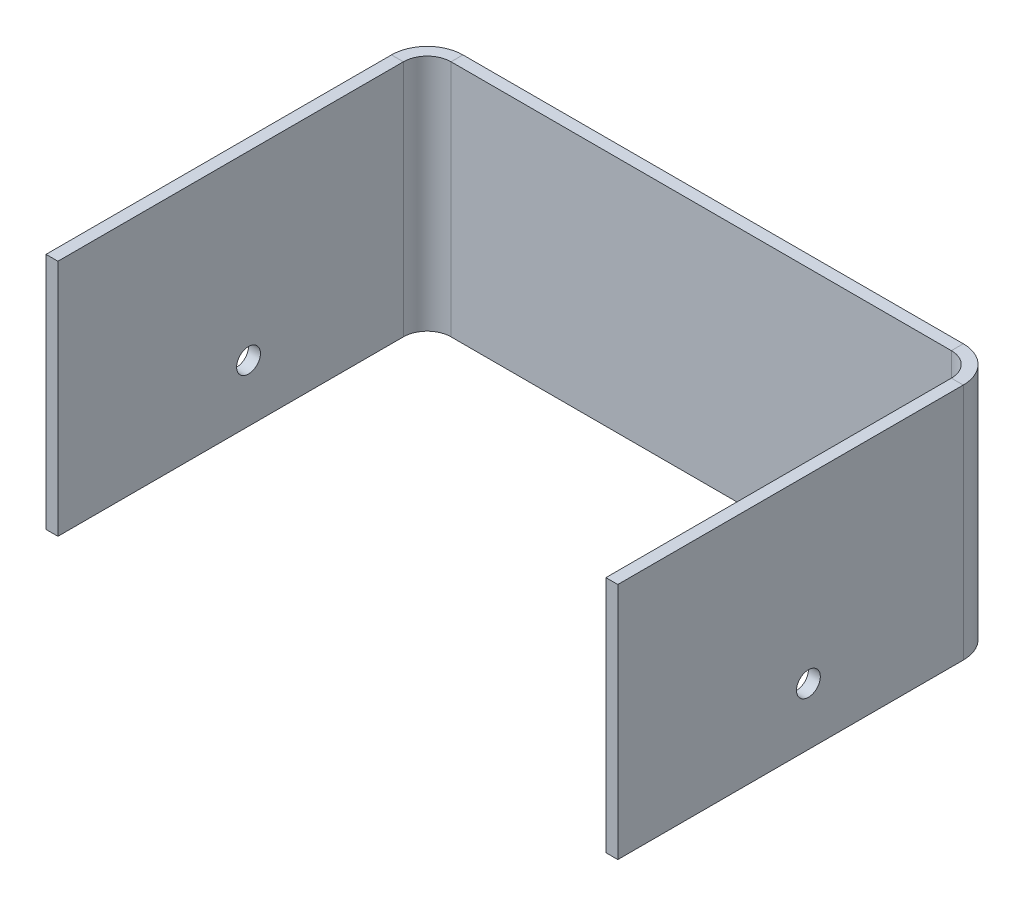
ISO-10303-21;
HEADER;
FILE_DESCRIPTION(('STEP AP214'),'2;1');
FILE_NAME('part.step','',(''),(''),'','','');
FILE_SCHEMA(('AUTOMOTIVE_DESIGN { 1 0 10303 214 1 1 1 1 }'));
ENDSEC;
DATA;
#1=APPLICATION_CONTEXT('core data for automotive mechanical design processes');
#2=APPLICATION_PROTOCOL_DEFINITION('international standard','automotive_design',2000,#1);
#3=PRODUCT_CONTEXT('',#1,'mechanical');
#4=PRODUCT('Part','Part','',(#3));
#5=PRODUCT_RELATED_PRODUCT_CATEGORY('part','',(#4));
#6=PRODUCT_DEFINITION_FORMATION('','',#4);
#7=PRODUCT_DEFINITION_CONTEXT('part definition',#1,'design');
#8=PRODUCT_DEFINITION('design','',#6,#7);
#9=PRODUCT_DEFINITION_SHAPE('','',#8);
#10=(LENGTH_UNIT() NAMED_UNIT(*) SI_UNIT(.MILLI.,.METRE.));
#11=(NAMED_UNIT(*) PLANE_ANGLE_UNIT() SI_UNIT($,.RADIAN.));
#12=(NAMED_UNIT(*) SI_UNIT($,.STERADIAN.) SOLID_ANGLE_UNIT());
#13=UNCERTAINTY_MEASURE_WITH_UNIT(LENGTH_MEASURE(1.E-05),#10,'distance_accuracy_value','');
#14=(GEOMETRIC_REPRESENTATION_CONTEXT(3) GLOBAL_UNCERTAINTY_ASSIGNED_CONTEXT((#13)) GLOBAL_UNIT_ASSIGNED_CONTEXT((#10,
#11,#12)) REPRESENTATION_CONTEXT('',''));
#15=CARTESIAN_POINT('',(0.,0.,0.));
#16=DIRECTION('',(0.,0.,1.));
#17=DIRECTION('',(1.,0.,0.));
#18=AXIS2_PLACEMENT_3D('',#15,#16,#17);
#19=CARTESIAN_POINT('',(0.,0.,3.175));
#20=DIRECTION('',(0.,0.,-1.));
#21=DIRECTION('',(-1.,0.,0.));
#22=AXIS2_PLACEMENT_3D('',#19,#20,#21);
#23=PLANE('',#22);
#24=DIRECTION('',(0.,1.,0.));
#25=VECTOR('',#24,1.);
#26=CARTESIAN_POINT('',(142.875,63.5,3.17500000000001));
#27=LINE('',#26,#25);
#28=CARTESIAN_POINT('',(142.875,63.5,3.17500000000001));
#29=VERTEX_POINT('',#28);
#30=CARTESIAN_POINT('',(142.875,0.,3.17500000000001));
#31=VERTEX_POINT('',#30);
#32=EDGE_CURVE('E245',#29,#31,#27,.F.);
#33=ORIENTED_EDGE('',*,*,#32,.F.);
#34=DIRECTION('',(-1.,0.,0.));
#35=VECTOR('',#34,1.);
#36=CARTESIAN_POINT('',(0.,63.5,3.175));
#37=LINE('',#36,#35);
#38=CARTESIAN_POINT('',(9.52499999999999,63.5,3.175));
#39=VERTEX_POINT('',#38);
#40=EDGE_CURVE('E13',#29,#39,#37,.T.);
#41=ORIENTED_EDGE('',*,*,#40,.T.);
#42=DIRECTION('',(0.,-1.,0.));
#43=VECTOR('',#42,1.);
#44=CARTESIAN_POINT('',(9.52499999999998,0.,3.175));
#45=LINE('',#44,#43);
#46=CARTESIAN_POINT('',(9.52499999999998,0.,3.175));
#47=VERTEX_POINT('',#46);
#48=EDGE_CURVE('E316',#47,#39,#45,.F.);
#49=ORIENTED_EDGE('',*,*,#48,.F.);
#50=DIRECTION('',(1.,0.,0.));
#51=VECTOR('',#50,1.);
#52=CARTESIAN_POINT('',(0.,0.,3.175));
#53=LINE('',#52,#51);
#54=EDGE_CURVE('E95',#47,#31,#53,.T.);
#55=ORIENTED_EDGE('',*,*,#54,.T.);
#56=EDGE_LOOP('',(#33,#41,#49,#55));
#57=FACE_BOUND('',#56,.T.);
#58=ADVANCED_FACE('F85',(#57),#23,.F.);
#59=CARTESIAN_POINT('',(0.,0.,0.));
#60=DIRECTION('',(0.,0.,-1.));
#61=DIRECTION('',(-1.,0.,0.));
#62=AXIS2_PLACEMENT_3D('',#59,#60,#61);
#63=PLANE('',#62);
#64=DIRECTION('',(-1.,0.,0.));
#65=VECTOR('',#64,1.);
#66=CARTESIAN_POINT('',(0.,63.5,0.));
#67=LINE('',#66,#65);
#68=CARTESIAN_POINT('',(142.875,63.5,0.));
#69=VERTEX_POINT('',#68);
#70=CARTESIAN_POINT('',(9.52499999999999,63.5,0.));
#71=VERTEX_POINT('',#70);
#72=EDGE_CURVE('E331',#69,#71,#67,.T.);
#73=ORIENTED_EDGE('',*,*,#72,.F.);
#74=DIRECTION('',(0.,1.,0.));
#75=VECTOR('',#74,1.);
#76=CARTESIAN_POINT('',(142.875,63.5,0.));
#77=LINE('',#76,#75);
#78=CARTESIAN_POINT('',(142.875,0.,0.));
#79=VERTEX_POINT('',#78);
#80=EDGE_CURVE('E230',#69,#79,#77,.F.);
#81=ORIENTED_EDGE('',*,*,#80,.T.);
#82=DIRECTION('',(-1.,0.,0.));
#83=VECTOR('',#82,1.);
#84=CARTESIAN_POINT('',(0.,0.,0.));
#85=LINE('',#84,#83);
#86=CARTESIAN_POINT('',(9.52499999999998,0.,0.));
#87=VERTEX_POINT('',#86);
#88=EDGE_CURVE('E325',#87,#79,#85,.F.);
#89=ORIENTED_EDGE('',*,*,#88,.F.);
#90=DIRECTION('',(0.,-1.,0.));
#91=VECTOR('',#90,1.);
#92=CARTESIAN_POINT('',(9.52499999999998,0.,0.));
#93=LINE('',#92,#91);
#94=EDGE_CURVE('E301',#87,#71,#93,.F.);
#95=ORIENTED_EDGE('',*,*,#94,.T.);
#96=EDGE_LOOP('',(#73,#81,#89,#95));
#97=FACE_BOUND('',#96,.T.);
#98=ADVANCED_FACE('F343',(#97),#63,.T.);
#99=CARTESIAN_POINT('',(0.,63.5,3.175));
#100=DIRECTION('',(0.,-1.,0.));
#101=DIRECTION('',(-1.,0.,0.));
#102=AXIS2_PLACEMENT_3D('',#99,#100,#101);
#103=PLANE('',#102);
#104=ORIENTED_EDGE('',*,*,#40,.F.);
#105=DIRECTION('',(0.,0.,-1.));
#106=VECTOR('',#105,1.);
#107=CARTESIAN_POINT('',(142.875,63.5,3.17500000000001));
#108=LINE('',#107,#106);
#109=EDGE_CURVE('E237',#29,#69,#108,.T.);
#110=ORIENTED_EDGE('',*,*,#109,.T.);
#111=ORIENTED_EDGE('',*,*,#72,.T.);
#112=DIRECTION('',(0.,0.,-1.));
#113=VECTOR('',#112,1.);
#114=CARTESIAN_POINT('',(9.52499999999999,63.5,3.175));
#115=LINE('',#114,#113);
#116=EDGE_CURVE('E322',#39,#71,#115,.T.);
#117=ORIENTED_EDGE('',*,*,#116,.F.);
#118=EDGE_LOOP('',(#104,#110,#111,#117));
#119=FACE_BOUND('',#118,.T.);
#120=ADVANCED_FACE('F351',(#119),#103,.F.);
#121=CARTESIAN_POINT('',(0.,0.,3.175));
#122=DIRECTION('',(0.,1.,0.));
#123=DIRECTION('',(1.,0.,0.));
#124=AXIS2_PLACEMENT_3D('',#121,#122,#123);
#125=PLANE('',#124);
#126=DIRECTION('',(0.,0.,-1.));
#127=VECTOR('',#126,1.);
#128=CARTESIAN_POINT('',(142.875,0.,3.17500000000001));
#129=LINE('',#128,#127);
#130=EDGE_CURVE('E252',#31,#79,#129,.T.);
#131=ORIENTED_EDGE('',*,*,#130,.F.);
#132=ORIENTED_EDGE('',*,*,#54,.F.);
#133=DIRECTION('',(0.,0.,-1.));
#134=VECTOR('',#133,1.);
#135=CARTESIAN_POINT('',(9.52499999999998,0.,3.175));
#136=LINE('',#135,#134);
#137=EDGE_CURVE('E308',#47,#87,#136,.T.);
#138=ORIENTED_EDGE('',*,*,#137,.T.);
#139=ORIENTED_EDGE('',*,*,#88,.T.);
#140=EDGE_LOOP('',(#131,#132,#138,#139));
#141=FACE_BOUND('',#140,.T.);
#142=ADVANCED_FACE('F87',(#141),#125,.F.);
#143=CARTESIAN_POINT('',(9.52499999999998,63.5,9.525));
#144=DIRECTION('',(0.,1.,0.));
#145=DIRECTION('',(-1.,0.,0.));
#146=AXIS2_PLACEMENT_3D('',#143,#144,#145);
#147=PLANE('',#146);
#148=DIRECTION('',(1.,0.,0.));
#149=VECTOR('',#148,1.);
#150=CARTESIAN_POINT('',(0.,63.5,9.52499999999997));
#151=LINE('',#150,#149);
#152=CARTESIAN_POINT('',(3.17499999999998,63.5,9.52499999999998));
#153=VERTEX_POINT('',#152);
#154=CARTESIAN_POINT('',(0.,63.5,9.52499999999997));
#155=VERTEX_POINT('',#154);
#156=EDGE_CURVE('E255',#153,#155,#151,.F.);
#157=ORIENTED_EDGE('',*,*,#156,.F.);
#158=CARTESIAN_POINT('',(9.52499999999998,63.5,9.525));
#159=DIRECTION('',(0.,-1.,0.));
#160=DIRECTION('',(1.,0.,0.));
#161=AXIS2_PLACEMENT_3D('',#158,#159,#160);
#162=CIRCLE('',#161,6.35);
#163=EDGE_CURVE('E312',#39,#153,#162,.F.);
#164=ORIENTED_EDGE('',*,*,#163,.F.);
#165=ORIENTED_EDGE('',*,*,#116,.T.);
#166=CARTESIAN_POINT('',(9.52499999999998,63.5,9.525));
#167=DIRECTION('',(0.,-1.,0.));
#168=DIRECTION('',(1.,0.,0.));
#169=AXIS2_PLACEMENT_3D('',#166,#167,#168);
#170=CIRCLE('',#169,9.525);
#171=EDGE_CURVE('E103',#71,#155,#170,.F.);
#172=ORIENTED_EDGE('',*,*,#171,.T.);
#173=EDGE_LOOP('',(#157,#164,#165,#172));
#174=FACE_BOUND('',#173,.T.);
#175=ADVANCED_FACE('F387',(#174),#147,.T.);
#176=CARTESIAN_POINT('',(9.52499999999997,0.,9.525));
#177=DIRECTION('',(0.,1.,0.));
#178=DIRECTION('',(-1.,0.,0.));
#179=AXIS2_PLACEMENT_3D('',#176,#177,#178);
#180=PLANE('',#179);
#181=CARTESIAN_POINT('',(9.52499999999997,0.,9.525));
#182=DIRECTION('',(0.,-1.,0.));
#183=DIRECTION('',(1.,0.,0.));
#184=AXIS2_PLACEMENT_3D('',#181,#182,#183);
#185=CIRCLE('',#184,6.35);
#186=CARTESIAN_POINT('',(3.17499999999997,0.,9.52499999999998));
#187=VERTEX_POINT('',#186);
#188=EDGE_CURVE('E263',#187,#47,#185,.T.);
#189=ORIENTED_EDGE('',*,*,#188,.F.);
#190=DIRECTION('',(1.,0.,0.));
#191=VECTOR('',#190,1.);
#192=CARTESIAN_POINT('',(3.17499999999998,0.,9.52499999999998));
#193=LINE('',#192,#191);
#194=CARTESIAN_POINT('',(0.,0.,9.52499999999997));
#195=VERTEX_POINT('',#194);
#196=EDGE_CURVE('E291',#187,#195,#193,.F.);
#197=ORIENTED_EDGE('',*,*,#196,.T.);
#198=CARTESIAN_POINT('',(9.52499999999997,0.,9.525));
#199=DIRECTION('',(0.,-1.,0.));
#200=DIRECTION('',(1.,0.,0.));
#201=AXIS2_PLACEMENT_3D('',#198,#199,#200);
#202=CIRCLE('',#201,9.525);
#203=EDGE_CURVE('E305',#195,#87,#202,.T.);
#204=ORIENTED_EDGE('',*,*,#203,.T.);
#205=ORIENTED_EDGE('',*,*,#137,.F.);
#206=EDGE_LOOP('',(#189,#197,#204,#205));
#207=FACE_BOUND('',#206,.T.);
#208=ADVANCED_FACE('F381',(#207),#180,.F.);
#209=CARTESIAN_POINT('',(9.52499999999997,0.,9.525));
#210=DIRECTION('',(0.,-1.,0.));
#211=DIRECTION('',(-1.,0.,0.));
#212=AXIS2_PLACEMENT_3D('',#209,#210,#211);
#213=CYLINDRICAL_SURFACE('',#212,9.525);
#214=ORIENTED_EDGE('',*,*,#94,.F.);
#215=ORIENTED_EDGE('',*,*,#203,.F.);
#216=DIRECTION('',(0.,-1.,0.));
#217=VECTOR('',#216,1.);
#218=CARTESIAN_POINT('',(0.,63.5,9.52499999999997));
#219=LINE('',#218,#217);
#220=EDGE_CURVE('E288',#195,#155,#219,.F.);
#221=ORIENTED_EDGE('',*,*,#220,.T.);
#222=ORIENTED_EDGE('',*,*,#171,.F.);
#223=EDGE_LOOP('',(#214,#215,#221,#222));
#224=FACE_BOUND('',#223,.T.);
#225=ADVANCED_FACE('F395',(#224),#213,.T.);
#226=CARTESIAN_POINT('',(9.52499999999997,0.,9.525));
#227=DIRECTION('',(0.,-1.,0.));
#228=DIRECTION('',(-1.,0.,0.));
#229=AXIS2_PLACEMENT_3D('',#226,#227,#228);
#230=CYLINDRICAL_SURFACE('',#229,6.35);
#231=ORIENTED_EDGE('',*,*,#48,.T.);
#232=ORIENTED_EDGE('',*,*,#163,.T.);
#233=DIRECTION('',(0.,-1.,0.));
#234=VECTOR('',#233,1.);
#235=CARTESIAN_POINT('',(3.17499999999998,63.5,9.52499999999998));
#236=LINE('',#235,#234);
#237=EDGE_CURVE('E295',#153,#187,#236,.T.);
#238=ORIENTED_EDGE('',*,*,#237,.T.);
#239=ORIENTED_EDGE('',*,*,#188,.T.);
#240=EDGE_LOOP('',(#231,#232,#238,#239));
#241=FACE_BOUND('',#240,.T.);
#242=ADVANCED_FACE('F398',(#241),#230,.F.);
#243=CARTESIAN_POINT('',(0.,63.5,3.17499999999999));
#244=DIRECTION('',(0.,-1.,0.));
#245=DIRECTION('',(0.,0.,-1.));
#246=AXIS2_PLACEMENT_3D('',#243,#244,#245);
#247=PLANE('',#246);
#248=ORIENTED_EDGE('',*,*,#156,.T.);
#249=DIRECTION('',(0.,0.,-1.));
#250=VECTOR('',#249,1.);
#251=CARTESIAN_POINT('',(0.,63.5,0.));
#252=LINE('',#251,#250);
#253=CARTESIAN_POINT('',(-3.43458801432613E-13,63.5,101.6));
#254=VERTEX_POINT('',#253);
#255=EDGE_CURVE('E274',#254,#155,#252,.T.);
#256=ORIENTED_EDGE('',*,*,#255,.F.);
#257=DIRECTION('',(1.,0.,0.));
#258=VECTOR('',#257,1.);
#259=CARTESIAN_POINT('',(-3.43649050775635E-13,63.5,101.6));
#260=LINE('',#259,#258);
#261=CARTESIAN_POINT('',(3.17499999999966,63.5,101.6));
#262=VERTEX_POINT('',#261);
#263=EDGE_CURVE('E264',#254,#262,#260,.T.);
#264=ORIENTED_EDGE('',*,*,#263,.T.);
#265=DIRECTION('',(0.,0.,1.));
#266=VECTOR('',#265,1.);
#267=CARTESIAN_POINT('',(3.175,63.5,3.175));
#268=LINE('',#267,#266);
#269=EDGE_CURVE('E284',#262,#153,#268,.F.);
#270=ORIENTED_EDGE('',*,*,#269,.T.);
#271=EDGE_LOOP('',(#248,#256,#264,#270));
#272=FACE_BOUND('',#271,.T.);
#273=ADVANCED_FACE('F401',(#272),#247,.F.);
#274=CARTESIAN_POINT('',(-3.43475248243408E-13,0.,101.6));
#275=DIRECTION('',(0.,1.,0.));
#276=DIRECTION('',(0.,0.,1.));
#277=AXIS2_PLACEMENT_3D('',#274,#275,#276);
#278=PLANE('',#277);
#279=ORIENTED_EDGE('',*,*,#196,.F.);
#280=DIRECTION('',(0.,0.,-1.));
#281=VECTOR('',#280,1.);
#282=CARTESIAN_POINT('',(3.17499999999966,0.,101.6));
#283=LINE('',#282,#281);
#284=CARTESIAN_POINT('',(3.17499999999966,0.,101.6));
#285=VERTEX_POINT('',#284);
#286=EDGE_CURVE('E281',#187,#285,#283,.F.);
#287=ORIENTED_EDGE('',*,*,#286,.T.);
#288=DIRECTION('',(1.,0.,0.));
#289=VECTOR('',#288,1.);
#290=CARTESIAN_POINT('',(-3.43475248243408E-13,0.,101.6));
#291=LINE('',#290,#289);
#292=CARTESIAN_POINT('',(-3.43458801432613E-13,0.,101.6));
#293=VERTEX_POINT('',#292);
#294=EDGE_CURVE('E259',#293,#285,#291,.T.);
#295=ORIENTED_EDGE('',*,*,#294,.F.);
#296=DIRECTION('',(0.,0.,1.));
#297=VECTOR('',#296,1.);
#298=CARTESIAN_POINT('',(0.,0.,0.));
#299=LINE('',#298,#297);
#300=EDGE_CURVE('E271',#195,#293,#299,.T.);
#301=ORIENTED_EDGE('',*,*,#300,.F.);
#302=EDGE_LOOP('',(#279,#287,#295,#301));
#303=FACE_BOUND('',#302,.T.);
#304=ADVANCED_FACE('F407',(#303),#278,.F.);
#305=CARTESIAN_POINT('',(0.,0.,0.));
#306=DIRECTION('',(1.,0.,0.));
#307=DIRECTION('',(0.,0.,-1.));
#308=AXIS2_PLACEMENT_3D('',#305,#306,#307);
#309=PLANE('',#308);
#310=CARTESIAN_POINT('',(-1.66533453693773E-13,15.24,50.8));
#311=DIRECTION('',(1.,0.,0.));
#312=DIRECTION('',(0.,0.,-1.));
#313=AXIS2_PLACEMENT_3D('',#310,#311,#312);
#314=CIRCLE('',#313,3.175);
#315=CARTESIAN_POINT('',(-1.66533453693773E-13,15.24,53.975));
#316=VERTEX_POINT('',#315);
#317=EDGE_CURVE('E229',#316,#316,#314,.T.);
#318=ORIENTED_EDGE('',*,*,#317,.T.);
#319=EDGE_LOOP('',(#318));
#320=FACE_BOUND('',#319,.T.);
#321=ORIENTED_EDGE('',*,*,#220,.F.);
#322=ORIENTED_EDGE('',*,*,#300,.T.);
#323=DIRECTION('',(0.,1.,0.));
#324=VECTOR('',#323,1.);
#325=CARTESIAN_POINT('',(-3.43458801432613E-13,0.,101.6));
#326=LINE('',#325,#324);
#327=EDGE_CURVE('E268',#293,#254,#326,.T.);
#328=ORIENTED_EDGE('',*,*,#327,.T.);
#329=ORIENTED_EDGE('',*,*,#255,.T.);
#330=EDGE_LOOP('',(#321,#322,#328,#329));
#331=FACE_BOUND('',#330,.T.);
#332=ADVANCED_FACE('F410',(#320,#331),#309,.F.);
#333=CARTESIAN_POINT('',(3.17500000000001,0.,0.));
#334=DIRECTION('',(1.,0.,0.));
#335=DIRECTION('',(0.,0.,-1.));
#336=AXIS2_PLACEMENT_3D('',#333,#334,#335);
#337=PLANE('',#336);
#338=CARTESIAN_POINT('',(3.17499999999984,15.24,50.8));
#339=DIRECTION('',(1.,0.,0.));
#340=DIRECTION('',(0.,0.,-1.));
#341=AXIS2_PLACEMENT_3D('',#338,#339,#340);
#342=CIRCLE('',#341,3.175);
#343=CARTESIAN_POINT('',(3.17499999999982,15.24,53.975));
#344=VERTEX_POINT('',#343);
#345=EDGE_CURVE('E439',#344,#344,#342,.T.);
#346=ORIENTED_EDGE('',*,*,#345,.F.);
#347=EDGE_LOOP('',(#346));
#348=FACE_BOUND('',#347,.T.);
#349=ORIENTED_EDGE('',*,*,#286,.F.);
#350=ORIENTED_EDGE('',*,*,#237,.F.);
#351=ORIENTED_EDGE('',*,*,#269,.F.);
#352=DIRECTION('',(0.,-1.,0.));
#353=VECTOR('',#352,1.);
#354=CARTESIAN_POINT('',(3.17499999999966,63.5,101.6));
#355=LINE('',#354,#353);
#356=EDGE_CURVE('E278',#285,#262,#355,.F.);
#357=ORIENTED_EDGE('',*,*,#356,.F.);
#358=EDGE_LOOP('',(#349,#350,#351,#357));
#359=FACE_BOUND('',#358,.T.);
#360=ADVANCED_FACE('F370',(#348,#359),#337,.T.);
#361=CARTESIAN_POINT('',(-3.43475248243408E-13,63.5,101.6));
#362=DIRECTION('',(0.,0.,-1.));
#363=DIRECTION('',(-1.,0.,0.));
#364=AXIS2_PLACEMENT_3D('',#361,#362,#363);
#365=PLANE('',#364);
#366=ORIENTED_EDGE('',*,*,#356,.T.);
#367=ORIENTED_EDGE('',*,*,#263,.F.);
#368=ORIENTED_EDGE('',*,*,#327,.F.);
#369=ORIENTED_EDGE('',*,*,#294,.T.);
#370=EDGE_LOOP('',(#366,#367,#368,#369));
#371=FACE_BOUND('',#370,.T.);
#372=ADVANCED_FACE('F363',(#371),#365,.F.);
#373=CARTESIAN_POINT('',(142.875,0.,9.525));
#374=DIRECTION('',(0.,-1.,0.));
#375=DIRECTION('',(0.,0.,-1.));
#376=AXIS2_PLACEMENT_3D('',#373,#374,#375);
#377=PLANE('',#376);
#378=DIRECTION('',(-1.,0.,0.));
#379=VECTOR('',#378,1.);
#380=CARTESIAN_POINT('',(152.4,0.,9.52499999999997));
#381=LINE('',#380,#379);
#382=CARTESIAN_POINT('',(149.225,0.,9.52499999999998));
#383=VERTEX_POINT('',#382);
#384=CARTESIAN_POINT('',(152.4,0.,9.52499999999997));
#385=VERTEX_POINT('',#384);
#386=EDGE_CURVE('E203',#383,#385,#381,.F.);
#387=ORIENTED_EDGE('',*,*,#386,.F.);
#388=CARTESIAN_POINT('',(142.875,0.,9.525));
#389=DIRECTION('',(0.,1.,0.));
#390=DIRECTION('',(0.,0.,1.));
#391=AXIS2_PLACEMENT_3D('',#388,#389,#390);
#392=CIRCLE('',#391,6.34999999999999);
#393=EDGE_CURVE('E241',#31,#383,#392,.F.);
#394=ORIENTED_EDGE('',*,*,#393,.F.);
#395=ORIENTED_EDGE('',*,*,#130,.T.);
#396=CARTESIAN_POINT('',(142.875,0.,9.525));
#397=DIRECTION('',(0.,1.,0.));
#398=DIRECTION('',(0.,0.,1.));
#399=AXIS2_PLACEMENT_3D('',#396,#397,#398);
#400=CIRCLE('',#399,9.525);
#401=EDGE_CURVE('E111',#79,#385,#400,.F.);
#402=ORIENTED_EDGE('',*,*,#401,.T.);
#403=EDGE_LOOP('',(#387,#394,#395,#402));
#404=FACE_BOUND('',#403,.T.);
#405=ADVANCED_FACE('F361',(#404),#377,.T.);
#406=CARTESIAN_POINT('',(142.875,63.5,9.525));
#407=DIRECTION('',(0.,-1.,0.));
#408=DIRECTION('',(0.,0.,-1.));
#409=AXIS2_PLACEMENT_3D('',#406,#407,#408);
#410=PLANE('',#409);
#411=CARTESIAN_POINT('',(142.875,63.5,9.525));
#412=DIRECTION('',(0.,1.,0.));
#413=DIRECTION('',(0.,0.,1.));
#414=AXIS2_PLACEMENT_3D('',#411,#412,#413);
#415=CIRCLE('',#414,6.34999999999999);
#416=CARTESIAN_POINT('',(149.225,63.5,9.52499999999998));
#417=VERTEX_POINT('',#416);
#418=EDGE_CURVE('E248',#417,#29,#415,.T.);
#419=ORIENTED_EDGE('',*,*,#418,.F.);
#420=DIRECTION('',(-1.,0.,0.));
#421=VECTOR('',#420,1.);
#422=CARTESIAN_POINT('',(149.225,63.5,9.52499999999998));
#423=LINE('',#422,#421);
#424=CARTESIAN_POINT('',(152.4,63.5,9.52499999999997));
#425=VERTEX_POINT('',#424);
#426=EDGE_CURVE('E220',#417,#425,#423,.F.);
#427=ORIENTED_EDGE('',*,*,#426,.T.);
#428=CARTESIAN_POINT('',(142.875,63.5,9.525));
#429=DIRECTION('',(0.,1.,0.));
#430=DIRECTION('',(0.,0.,1.));
#431=AXIS2_PLACEMENT_3D('',#428,#429,#430);
#432=CIRCLE('',#431,9.525);
#433=EDGE_CURVE('E234',#425,#69,#432,.T.);
#434=ORIENTED_EDGE('',*,*,#433,.T.);
#435=ORIENTED_EDGE('',*,*,#109,.F.);
#436=EDGE_LOOP('',(#419,#427,#434,#435));
#437=FACE_BOUND('',#436,.T.);
#438=ADVANCED_FACE('F347',(#437),#410,.F.);
#439=CARTESIAN_POINT('',(142.875,63.5,9.525));
#440=DIRECTION('',(0.,1.,0.));
#441=DIRECTION('',(1.,0.,0.));
#442=AXIS2_PLACEMENT_3D('',#439,#440,#441);
#443=CYLINDRICAL_SURFACE('',#442,9.525);
#444=ORIENTED_EDGE('',*,*,#80,.F.);
#445=ORIENTED_EDGE('',*,*,#433,.F.);
#446=DIRECTION('',(0.,1.,0.));
#447=VECTOR('',#446,1.);
#448=CARTESIAN_POINT('',(152.4,0.,9.52499999999997));
#449=LINE('',#448,#447);
#450=EDGE_CURVE('E217',#425,#385,#449,.F.);
#451=ORIENTED_EDGE('',*,*,#450,.T.);
#452=ORIENTED_EDGE('',*,*,#401,.F.);
#453=EDGE_LOOP('',(#444,#445,#451,#452));
#454=FACE_BOUND('',#453,.T.);
#455=ADVANCED_FACE('F344',(#454),#443,.T.);
#456=CARTESIAN_POINT('',(142.875,63.5,9.525));
#457=DIRECTION('',(0.,1.,0.));
#458=DIRECTION('',(1.,0.,0.));
#459=AXIS2_PLACEMENT_3D('',#456,#457,#458);
#460=CYLINDRICAL_SURFACE('',#459,6.34999999999999);
#461=ORIENTED_EDGE('',*,*,#32,.T.);
#462=ORIENTED_EDGE('',*,*,#393,.T.);
#463=DIRECTION('',(0.,1.,0.));
#464=VECTOR('',#463,1.);
#465=CARTESIAN_POINT('',(149.225,0.,9.52499999999998));
#466=LINE('',#465,#464);
#467=EDGE_CURVE('E224',#383,#417,#466,.T.);
#468=ORIENTED_EDGE('',*,*,#467,.T.);
#469=ORIENTED_EDGE('',*,*,#418,.T.);
#470=EDGE_LOOP('',(#461,#462,#468,#469));
#471=FACE_BOUND('',#470,.T.);
#472=ADVANCED_FACE('F358',(#471),#460,.F.);
#473=CARTESIAN_POINT('',(152.4,0.,3.17499999999999));
#474=DIRECTION('',(0.,1.,0.));
#475=DIRECTION('',(0.,0.,1.));
#476=AXIS2_PLACEMENT_3D('',#473,#474,#475);
#477=PLANE('',#476);
#478=ORIENTED_EDGE('',*,*,#386,.T.);
#479=DIRECTION('',(0.,0.,-1.));
#480=VECTOR('',#479,1.);
#481=CARTESIAN_POINT('',(152.4,0.,-5.2680195501219E-13));
#482=LINE('',#481,#480);
#483=CARTESIAN_POINT('',(152.4,0.,101.6));
#484=VERTEX_POINT('',#483);
#485=EDGE_CURVE('E182',#484,#385,#482,.T.);
#486=ORIENTED_EDGE('',*,*,#485,.F.);
#487=DIRECTION('',(-1.,0.,0.));
#488=VECTOR('',#487,1.);
#489=CARTESIAN_POINT('',(152.4,0.,101.6));
#490=LINE('',#489,#488);
#491=CARTESIAN_POINT('',(149.225,0.,101.6));
#492=VERTEX_POINT('',#491);
#493=EDGE_CURVE('E189',#484,#492,#490,.T.);
#494=ORIENTED_EDGE('',*,*,#493,.T.);
#495=DIRECTION('',(0.,0.,1.));
#496=VECTOR('',#495,1.);
#497=CARTESIAN_POINT('',(149.225,0.,3.175));
#498=LINE('',#497,#496);
#499=EDGE_CURVE('E214',#492,#383,#498,.F.);
#500=ORIENTED_EDGE('',*,*,#499,.T.);
#501=EDGE_LOOP('',(#478,#486,#494,#500));
#502=FACE_BOUND('',#501,.T.);
#503=ADVANCED_FACE('F202',(#502),#477,.F.);
#504=CARTESIAN_POINT('',(152.4,63.5,101.6));
#505=DIRECTION('',(0.,-1.,0.));
#506=DIRECTION('',(0.,0.,-1.));
#507=AXIS2_PLACEMENT_3D('',#504,#505,#506);
#508=PLANE('',#507);
#509=ORIENTED_EDGE('',*,*,#426,.F.);
#510=DIRECTION('',(0.,0.,-1.));
#511=VECTOR('',#510,1.);
#512=CARTESIAN_POINT('',(149.225,63.5,101.6));
#513=LINE('',#512,#511);
#514=CARTESIAN_POINT('',(149.225,63.5,101.6));
#515=VERTEX_POINT('',#514);
#516=EDGE_CURVE('E209',#417,#515,#513,.F.);
#517=ORIENTED_EDGE('',*,*,#516,.T.);
#518=DIRECTION('',(-1.,0.,0.));
#519=VECTOR('',#518,1.);
#520=CARTESIAN_POINT('',(152.4,63.5,101.6));
#521=LINE('',#520,#519);
#522=CARTESIAN_POINT('',(152.4,63.5,101.6));
#523=VERTEX_POINT('',#522);
#524=EDGE_CURVE('E199',#523,#515,#521,.T.);
#525=ORIENTED_EDGE('',*,*,#524,.F.);
#526=DIRECTION('',(0.,0.,1.));
#527=VECTOR('',#526,1.);
#528=CARTESIAN_POINT('',(152.4,63.5,-5.2680195501219E-13));
#529=LINE('',#528,#527);
#530=EDGE_CURVE('E184',#425,#523,#529,.T.);
#531=ORIENTED_EDGE('',*,*,#530,.F.);
#532=EDGE_LOOP('',(#509,#517,#525,#531));
#533=FACE_BOUND('',#532,.T.);
#534=ADVANCED_FACE('F451',(#533),#508,.F.);
#535=CARTESIAN_POINT('',(152.4,0.,-5.2680195501219E-13));
#536=DIRECTION('',(-1.,0.,0.));
#537=DIRECTION('',(0.,0.,1.));
#538=AXIS2_PLACEMENT_3D('',#535,#536,#537);
#539=PLANE('',#538);
#540=CARTESIAN_POINT('',(152.400000000001,15.24,50.8000000000005));
#541=DIRECTION('',(-1.,0.,0.));
#542=DIRECTION('',(0.,0.,1.));
#543=AXIS2_PLACEMENT_3D('',#540,#541,#542);
#544=CIRCLE('',#543,3.175);
#545=CARTESIAN_POINT('',(152.400000000001,15.24,53.9750000000005));
#546=VERTEX_POINT('',#545);
#547=EDGE_CURVE('E714',#546,#546,#544,.T.);
#548=ORIENTED_EDGE('',*,*,#547,.T.);
#549=EDGE_LOOP('',(#548));
#550=FACE_BOUND('',#549,.T.);
#551=ORIENTED_EDGE('',*,*,#450,.F.);
#552=ORIENTED_EDGE('',*,*,#530,.T.);
#553=DIRECTION('',(0.,-1.,0.));
#554=VECTOR('',#553,1.);
#555=CARTESIAN_POINT('',(152.4,0.,101.6));
#556=LINE('',#555,#554);
#557=EDGE_CURVE('E177',#523,#484,#556,.T.);
#558=ORIENTED_EDGE('',*,*,#557,.T.);
#559=ORIENTED_EDGE('',*,*,#485,.T.);
#560=EDGE_LOOP('',(#551,#552,#558,#559));
#561=FACE_BOUND('',#560,.T.);
#562=ADVANCED_FACE('F180',(#550,#561),#539,.F.);
#563=CARTESIAN_POINT('',(149.225,0.,-5.15716501761363E-13));
#564=DIRECTION('',(-1.,0.,0.));
#565=DIRECTION('',(0.,0.,1.));
#566=AXIS2_PLACEMENT_3D('',#563,#564,#565);
#567=PLANE('',#566);
#568=CARTESIAN_POINT('',(149.225,15.24,50.8000000000005));
#569=DIRECTION('',(-1.,0.,0.));
#570=DIRECTION('',(0.,0.,1.));
#571=AXIS2_PLACEMENT_3D('',#568,#569,#570);
#572=CIRCLE('',#571,3.175);
#573=CARTESIAN_POINT('',(149.225,15.24,53.9750000000005));
#574=VERTEX_POINT('',#573);
#575=EDGE_CURVE('E89',#574,#574,#572,.T.);
#576=ORIENTED_EDGE('',*,*,#575,.F.);
#577=EDGE_LOOP('',(#576));
#578=FACE_BOUND('',#577,.T.);
#579=ORIENTED_EDGE('',*,*,#516,.F.);
#580=ORIENTED_EDGE('',*,*,#467,.F.);
#581=ORIENTED_EDGE('',*,*,#499,.F.);
#582=DIRECTION('',(0.,1.,0.));
#583=VECTOR('',#582,1.);
#584=CARTESIAN_POINT('',(149.225,0.,101.6));
#585=LINE('',#584,#583);
#586=EDGE_CURVE('E194',#515,#492,#585,.F.);
#587=ORIENTED_EDGE('',*,*,#586,.F.);
#588=EDGE_LOOP('',(#579,#580,#581,#587));
#589=FACE_BOUND('',#588,.T.);
#590=ADVANCED_FACE('F450',(#578,#589),#567,.T.);
#591=CARTESIAN_POINT('',(152.4,0.,101.6));
#592=DIRECTION('',(0.,0.,-1.));
#593=DIRECTION('',(-1.,0.,0.));
#594=AXIS2_PLACEMENT_3D('',#591,#592,#593);
#595=PLANE('',#594);
#596=ORIENTED_EDGE('',*,*,#586,.T.);
#597=ORIENTED_EDGE('',*,*,#493,.F.);
#598=ORIENTED_EDGE('',*,*,#557,.F.);
#599=ORIENTED_EDGE('',*,*,#524,.T.);
#600=EDGE_LOOP('',(#596,#597,#598,#599));
#601=FACE_BOUND('',#600,.T.);
#602=ADVANCED_FACE('F192',(#601),#595,.F.);
#603=CARTESIAN_POINT('',(152.400000000001,15.24,50.8000000000005));
#604=DIRECTION('',(-1.,0.,0.));
#605=DIRECTION('',(0.,0.,1.));
#606=AXIS2_PLACEMENT_3D('',#603,#604,#605);
#607=CYLINDRICAL_SURFACE('',#606,3.175);
#608=CARTESIAN_POINT('',(149.225,15.24,53.9750000000005));
#609=CARTESIAN_POINT('',(149.258072916667,15.24,53.9750000000005));
#610=CARTESIAN_POINT('',(149.291145833334,15.24,53.9750000000005));
#611=CARTESIAN_POINT('',(149.357291666667,15.24,53.9750000000005));
#612=CARTESIAN_POINT('',(149.390364583334,15.24,53.9750000000005));
#613=CARTESIAN_POINT('',(149.456510416667,15.24,53.9750000000005));
#614=CARTESIAN_POINT('',(149.489583333334,15.24,53.9750000000005));
#615=CARTESIAN_POINT('',(149.555729166667,15.24,53.9750000000005));
#616=CARTESIAN_POINT('',(149.588802083334,15.24,53.9750000000005));
#617=CARTESIAN_POINT('',(149.654947916667,15.24,53.9750000000005));
#618=CARTESIAN_POINT('',(149.688020833334,15.24,53.9750000000005));
#619=CARTESIAN_POINT('',(149.754166666667,15.24,53.9750000000005));
#620=CARTESIAN_POINT('',(149.787239583334,15.24,53.9750000000005));
#621=CARTESIAN_POINT('',(149.853385416667,15.24,53.9750000000005));
#622=CARTESIAN_POINT('',(149.886458333334,15.24,53.9750000000005));
#623=CARTESIAN_POINT('',(149.952604166667,15.24,53.9750000000005));
#624=CARTESIAN_POINT('',(149.985677083334,15.24,53.9750000000005));
#625=CARTESIAN_POINT('',(150.051822916667,15.24,53.9750000000005));
#626=CARTESIAN_POINT('',(150.084895833334,15.24,53.9750000000005));
#627=CARTESIAN_POINT('',(150.151041666667,15.24,53.9750000000005));
#628=CARTESIAN_POINT('',(150.184114583334,15.24,53.9750000000005));
#629=CARTESIAN_POINT('',(150.250260416667,15.24,53.9750000000005));
#630=CARTESIAN_POINT('',(150.283333333334,15.24,53.9750000000005));
#631=CARTESIAN_POINT('',(150.349479166667,15.24,53.9750000000005));
#632=CARTESIAN_POINT('',(150.382552083334,15.24,53.9750000000005));
#633=CARTESIAN_POINT('',(150.448697916667,15.24,53.9750000000005));
#634=CARTESIAN_POINT('',(150.481770833334,15.24,53.9750000000005));
#635=CARTESIAN_POINT('',(150.547916666667,15.24,53.9750000000005));
#636=CARTESIAN_POINT('',(150.580989583334,15.24,53.9750000000005));
#637=CARTESIAN_POINT('',(150.647135416667,15.24,53.9750000000005));
#638=CARTESIAN_POINT('',(150.680208333334,15.24,53.9750000000005));
#639=CARTESIAN_POINT('',(150.746354166667,15.24,53.9750000000005));
#640=CARTESIAN_POINT('',(150.779427083334,15.24,53.9750000000005));
#641=CARTESIAN_POINT('',(150.845572916667,15.24,53.9750000000005));
#642=CARTESIAN_POINT('',(150.878645833334,15.24,53.9750000000005));
#643=CARTESIAN_POINT('',(150.944791666667,15.24,53.9750000000005));
#644=CARTESIAN_POINT('',(150.977864583334,15.24,53.9750000000005));
#645=CARTESIAN_POINT('',(151.044010416667,15.24,53.9750000000005));
#646=CARTESIAN_POINT('',(151.077083333334,15.24,53.9750000000005));
#647=CARTESIAN_POINT('',(151.143229166667,15.24,53.9750000000005));
#648=CARTESIAN_POINT('',(151.176302083334,15.24,53.9750000000005));
#649=CARTESIAN_POINT('',(151.242447916667,15.24,53.9750000000005));
#650=CARTESIAN_POINT('',(151.275520833334,15.24,53.9750000000005));
#651=CARTESIAN_POINT('',(151.341666666667,15.24,53.9750000000005));
#652=CARTESIAN_POINT('',(151.374739583334,15.24,53.9750000000005));
#653=CARTESIAN_POINT('',(151.440885416667,15.24,53.9750000000005));
#654=CARTESIAN_POINT('',(151.473958333334,15.24,53.9750000000005));
#655=CARTESIAN_POINT('',(151.540104166667,15.24,53.9750000000005));
#656=CARTESIAN_POINT('',(151.573177083334,15.24,53.9750000000005));
#657=CARTESIAN_POINT('',(151.639322916667,15.24,53.9750000000005));
#658=CARTESIAN_POINT('',(151.672395833334,15.24,53.9750000000005));
#659=CARTESIAN_POINT('',(151.738541666667,15.24,53.9750000000005));
#660=CARTESIAN_POINT('',(151.771614583334,15.24,53.9750000000005));
#661=CARTESIAN_POINT('',(151.837760416667,15.24,53.9750000000005));
#662=CARTESIAN_POINT('',(151.870833333334,15.24,53.9750000000005));
#663=CARTESIAN_POINT('',(151.936979166667,15.24,53.9750000000005));
#664=CARTESIAN_POINT('',(151.970052083334,15.24,53.9750000000005));
#665=CARTESIAN_POINT('',(152.036197916667,15.24,53.9750000000005));
#666=CARTESIAN_POINT('',(152.069270833334,15.24,53.9750000000005));
#667=CARTESIAN_POINT('',(152.135416666667,15.24,53.9750000000005));
#668=CARTESIAN_POINT('',(152.168489583334,15.24,53.9750000000005));
#669=CARTESIAN_POINT('',(152.234635416667,15.24,53.9750000000005));
#670=CARTESIAN_POINT('',(152.267708333334,15.24,53.9750000000005));
#671=CARTESIAN_POINT('',(152.333854166667,15.24,53.9750000000005));
#672=CARTESIAN_POINT('',(152.366927083334,15.24,53.9750000000005));
#673=CARTESIAN_POINT('',(152.400000000001,15.24,53.9750000000005));
#674=B_SPLINE_CURVE_WITH_KNOTS('',3,(#608,#609,#610,#611,#612,#613,#614,#615,#616,#617,#618,
#619,#620,#621,#622,#623,#624,#625,#626,#627,#628,#629,#630,#631,#632,#633,#634,#635,#636,#637,
#638,#639,#640,#641,#642,#643,#644,#645,#646,#647,#648,#649,#650,#651,#652,#653,#654,#655,#656,
#657,#658,#659,#660,#661,#662,#663,#664,#665,#666,#667,#668,#669,#670,#671,#672,#673),
.UNSPECIFIED.,.F.,.F.,(4,2,2,2,2,2,2,2,2,2,2,2,2,2,2,2,2,2,2,2,2,2,2,2,2,2,2,2,2,2,2,2,4),(0.,
0.0992187500000186,0.198437500000037,0.297656250000056,0.396875000000046,0.496093750000065,
0.595312500000084,0.694531250000102,0.793750000000093,0.892968750000112,0.99218750000013,
1.09140625000012,1.19062500000014,1.28984375000016,1.38906250000018,1.48828125000017,
1.58750000000019,1.6867187500002,1.7859375000002,1.88515625000021,1.98437500000023,
2.08359375000025,2.18281250000024,2.28203125000026,2.38125000000028,2.48046875000027,
2.57968750000029,2.67890625000031,2.77812500000033,2.87734375000032,2.97656250000033,
3.07578125000035,3.17500000000037),.UNSPECIFIED.);
#675=EDGE_CURVE('BSEAM489',#574,#546,#674,.T.);
#676=ORIENTED_EDGE('',*,*,#575,.T.);
#677=ORIENTED_EDGE('',*,*,#547,.F.);
#678=ORIENTED_EDGE('',*,*,#675,.T.);
#679=ORIENTED_EDGE('',*,*,#675,.F.);
#680=EDGE_LOOP('',(#676,#678,#677,#679));
#681=FACE_BOUND('',#680,.T.);
#682=ADVANCED_FACE('F489',(#681),#607,.F.);
#683=CARTESIAN_POINT('',(3.17499999999982,15.24,53.975));
#684=CARTESIAN_POINT('',(3.14192708333315,15.24,53.975));
#685=CARTESIAN_POINT('',(3.10885416666649,15.24,53.975));
#686=CARTESIAN_POINT('',(3.04270833333315,15.24,53.975));
#687=CARTESIAN_POINT('',(3.00963541666648,15.24,53.975));
#688=CARTESIAN_POINT('',(2.94348958333314,15.24,53.975));
#689=CARTESIAN_POINT('',(2.91041666666648,15.24,53.975));
#690=CARTESIAN_POINT('',(2.84427083333315,15.24,53.975));
#691=CARTESIAN_POINT('',(2.81119791666649,15.24,53.975));
#692=CARTESIAN_POINT('',(2.74505208333315,15.24,53.975));
#693=CARTESIAN_POINT('',(2.71197916666648,15.24,53.975));
#694=CARTESIAN_POINT('',(2.64583333333314,15.24,53.975));
#695=CARTESIAN_POINT('',(2.61276041666648,15.24,53.975));
#696=CARTESIAN_POINT('',(2.54661458333315,15.24,53.975));
#697=CARTESIAN_POINT('',(2.51354166666649,15.24,53.975));
#698=CARTESIAN_POINT('',(2.44739583333316,15.24,53.975));
#699=CARTESIAN_POINT('',(2.4143229166665,15.24,53.975));
#700=CARTESIAN_POINT('',(2.34817708333316,15.24,53.975));
#701=CARTESIAN_POINT('',(2.31510416666649,15.24,53.975));
#702=CARTESIAN_POINT('',(2.24895833333315,15.24,53.975));
#703=CARTESIAN_POINT('',(2.21588541666649,15.24,53.975));
#704=CARTESIAN_POINT('',(2.14973958333316,15.24,53.975));
#705=CARTESIAN_POINT('',(2.1166666666665,15.24,53.975));
#706=CARTESIAN_POINT('',(2.05052083333316,15.24,53.975));
#707=CARTESIAN_POINT('',(2.01744791666649,15.24,53.975));
#708=CARTESIAN_POINT('',(1.95130208333315,15.24,53.975));
#709=CARTESIAN_POINT('',(1.91822916666649,15.24,53.975));
#710=CARTESIAN_POINT('',(1.85208333333316,15.24,53.975));
#711=CARTESIAN_POINT('',(1.8190104166665,15.24,53.975));
#712=CARTESIAN_POINT('',(1.75286458333316,15.24,53.975));
#713=CARTESIAN_POINT('',(1.71979166666649,15.24,53.975));
#714=CARTESIAN_POINT('',(1.65364583333315,15.24,53.975));
#715=CARTESIAN_POINT('',(1.62057291666649,15.24,53.975));
#716=CARTESIAN_POINT('',(1.55442708333316,15.24,53.975));
#717=CARTESIAN_POINT('',(1.5213541666665,15.24,53.975));
#718=CARTESIAN_POINT('',(1.45520833333316,15.24,53.975));
#719=CARTESIAN_POINT('',(1.42213541666649,15.24,53.975));
#720=CARTESIAN_POINT('',(1.35598958333315,15.24,53.975));
#721=CARTESIAN_POINT('',(1.32291666666649,15.24,53.975));
#722=CARTESIAN_POINT('',(1.25677083333316,15.24,53.975));
#723=CARTESIAN_POINT('',(1.2236979166665,15.24,53.975));
#724=CARTESIAN_POINT('',(1.15755208333316,15.24,53.975));
#725=CARTESIAN_POINT('',(1.12447916666649,15.24,53.975));
#726=CARTESIAN_POINT('',(1.05833333333315,15.24,53.975));
#727=CARTESIAN_POINT('',(1.02526041666649,15.24,53.975));
#728=CARTESIAN_POINT('',(0.959114583333161,15.24,53.975));
#729=CARTESIAN_POINT('',(0.926041666666498,15.24,53.975));
#730=CARTESIAN_POINT('',(0.859895833333161,15.24,53.975));
#731=CARTESIAN_POINT('',(0.826822916666488,15.24,53.975));
#732=CARTESIAN_POINT('',(0.760677083333152,15.24,53.975));
#733=CARTESIAN_POINT('',(0.727604166666488,15.24,53.975));
#734=CARTESIAN_POINT('',(0.661458333333161,15.24,53.975));
#735=CARTESIAN_POINT('',(0.628385416666497,15.24,53.975));
#736=CARTESIAN_POINT('',(0.56223958333317,15.24,53.975));
#737=CARTESIAN_POINT('',(0.529166666666507,15.24,53.975));
#738=CARTESIAN_POINT('',(0.46302083333317,15.24,53.975));
#739=CARTESIAN_POINT('',(0.429947916666497,15.24,53.975));
#740=CARTESIAN_POINT('',(0.363802083333161,15.24,53.975));
#741=CARTESIAN_POINT('',(0.330729166666497,15.24,53.975));
#742=CARTESIAN_POINT('',(0.26458333333317,15.24,53.975));
#743=CARTESIAN_POINT('',(0.231510416666506,15.24,53.975));
#744=CARTESIAN_POINT('',(0.16536458333317,15.24,53.975));
#745=CARTESIAN_POINT('',(0.132291666666497,15.24,53.975));
#746=CARTESIAN_POINT('',(0.0661458333331607,15.24,53.975));
#747=CARTESIAN_POINT('',(0.0330729166664971,15.24,53.975));
#748=CARTESIAN_POINT('',(-1.66533453693773E-13,15.24,53.975));
#749=B_SPLINE_CURVE_WITH_KNOTS('',3,(#683,#684,#685,#686,#687,#688,#689,#690,#691,#692,#693,
#694,#695,#696,#697,#698,#699,#700,#701,#702,#703,#704,#705,#706,#707,#708,#709,#710,#711,#712,
#713,#714,#715,#716,#717,#718,#719,#720,#721,#722,#723,#724,#725,#726,#727,#728,#729,#730,#731,
#732,#733,#734,#735,#736,#737,#738,#739,#740,#741,#742,#743,#744,#745,#746,#747,#748),
.UNSPECIFIED.,.F.,.F.,(4,2,2,2,2,2,2,2,2,2,2,2,2,2,2,2,2,2,2,2,2,2,2,2,2,2,2,2,2,2,2,2,4),(0.,
0.0992187499999908,0.198437500000009,0.29765625,0.396874999999991,0.49609375000001,0.5953125,
0.694531249999991,0.793749999999982,0.892968750000001,0.992187499999991,1.09140624999998,
1.190625,1.28984374999999,1.38906249999998,1.48828125,1.58749999999999,1.68671874999998,
1.7859375,1.88515624999999,1.98437499999998,2.08359375,2.18281249999999,2.28203124999998,
2.38125,2.48046874999999,2.57968749999998,2.67890624999997,2.77812499999999,2.87734374999998,
2.97656249999997,3.07578124999999,3.17499999999998),.UNSPECIFIED.);
#750=EDGE_CURVE('BSEAM528',#344,#316,#749,.T.);
#751=ORIENTED_EDGE('',*,*,#345,.T.);
#752=ORIENTED_EDGE('',*,*,#317,.F.);
#753=ORIENTED_EDGE('',*,*,#750,.T.);
#754=ORIENTED_EDGE('',*,*,#750,.F.);
#755=EDGE_LOOP('',(#751,#753,#752,#754));
#756=FACE_BOUND('',#755,.T.);
#757=ADVANCED_FACE('F528',(#756),#607,.F.);
#758=CLOSED_SHELL('',(#58,#98,#120,#142,#175,#208,#225,#242,#273,#304,#332,#360,#372,#405,#438,
#455,#472,#503,#534,#562,#590,#602,#682,#757));
#759=MANIFOLD_SOLID_BREP('B2',#758);
#760=ADVANCED_BREP_SHAPE_REPRESENTATION('',(#18,#759),#14);
#761=SHAPE_DEFINITION_REPRESENTATION(#9,#760);
ENDSEC;
END-ISO-10303-21;
